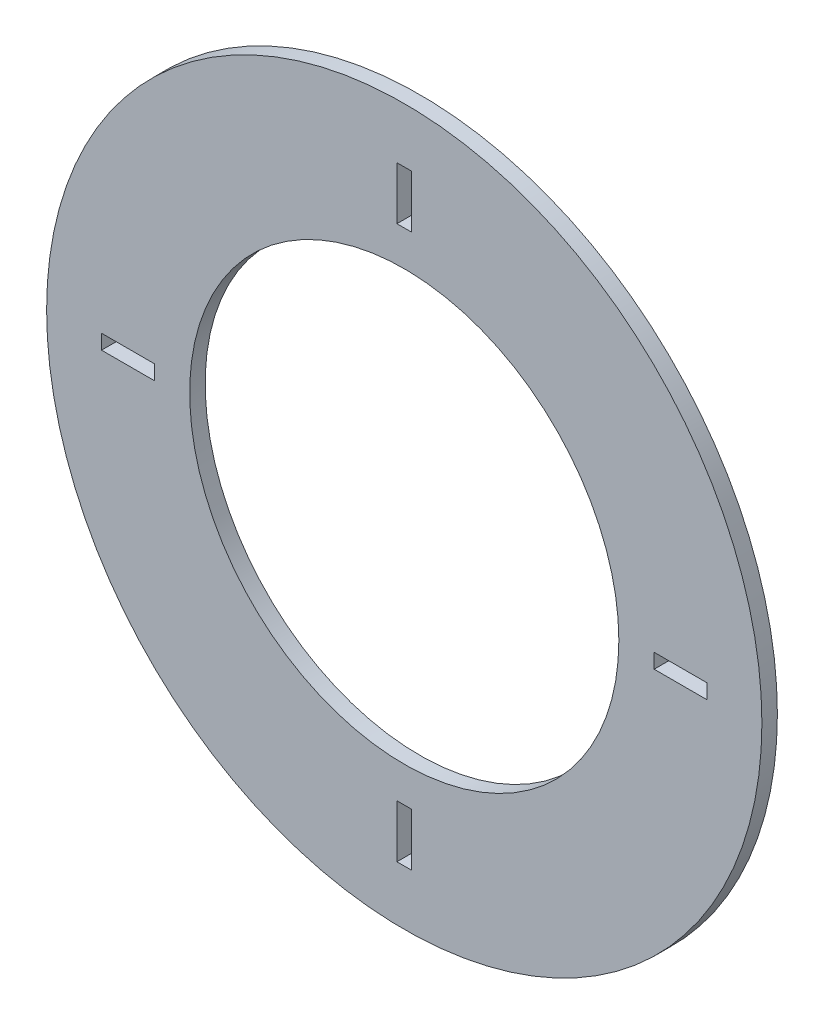
ISO-10303-21;
HEADER;
FILE_DESCRIPTION(('STEP AP214'),'2;1');
FILE_NAME('part.step','',(''),(''),'','','');
FILE_SCHEMA(('AUTOMOTIVE_DESIGN { 1 0 10303 214 1 1 1 1 }'));
ENDSEC;
DATA;
#1=APPLICATION_CONTEXT('core data for automotive mechanical design processes');
#2=APPLICATION_PROTOCOL_DEFINITION('international standard','automotive_design',2000,#1);
#3=PRODUCT_CONTEXT('',#1,'mechanical');
#4=PRODUCT('Part','Part','',(#3));
#5=PRODUCT_RELATED_PRODUCT_CATEGORY('part','',(#4));
#6=PRODUCT_DEFINITION_FORMATION('','',#4);
#7=PRODUCT_DEFINITION_CONTEXT('part definition',#1,'design');
#8=PRODUCT_DEFINITION('design','',#6,#7);
#9=PRODUCT_DEFINITION_SHAPE('','',#8);
#10=(LENGTH_UNIT() NAMED_UNIT(*) SI_UNIT(.MILLI.,.METRE.));
#11=(NAMED_UNIT(*) PLANE_ANGLE_UNIT() SI_UNIT($,.RADIAN.));
#12=(NAMED_UNIT(*) SI_UNIT($,.STERADIAN.) SOLID_ANGLE_UNIT());
#13=UNCERTAINTY_MEASURE_WITH_UNIT(LENGTH_MEASURE(1.E-05),#10,'distance_accuracy_value','');
#14=(GEOMETRIC_REPRESENTATION_CONTEXT(3) GLOBAL_UNCERTAINTY_ASSIGNED_CONTEXT((#13)) GLOBAL_UNIT_ASSIGNED_CONTEXT((#10,
#11,#12)) REPRESENTATION_CONTEXT('',''));
#15=CARTESIAN_POINT('',(0.,0.,0.));
#16=DIRECTION('',(0.,0.,1.));
#17=DIRECTION('',(1.,0.,0.));
#18=AXIS2_PLACEMENT_3D('',#15,#16,#17);
#19=CARTESIAN_POINT('',(0.,0.,2.750000088));
#20=DIRECTION('',(0.,0.,1.));
#21=DIRECTION('',(1.,0.,0.));
#22=AXIS2_PLACEMENT_3D('',#19,#20,#21);
#23=PLANE('',#22);
#24=DIRECTION('',(0.,1.,0.));
#25=VECTOR('',#24,1.);
#26=CARTESIAN_POINT('',(1.302500062,53.7452039097512,2.750000088));
#27=LINE('',#26,#25);
#28=CARTESIAN_POINT('',(1.302500062,44.3652038737512,2.750000088));
#29=VERTEX_POINT('',#28);
#30=CARTESIAN_POINT('',(1.302500062,53.7452039097512,2.750000088));
#31=VERTEX_POINT('',#30);
#32=EDGE_CURVE('E61',#29,#31,#27,.T.);
#33=ORIENTED_EDGE('',*,*,#32,.F.);
#34=DIRECTION('',(1.,0.,0.));
#35=VECTOR('',#34,1.);
#36=CARTESIAN_POINT('',(-1.302500062,44.3652038737512,2.750000088));
#37=LINE('',#36,#35);
#38=CARTESIAN_POINT('',(-1.302500062,44.3652038737512,2.750000088));
#39=VERTEX_POINT('',#38);
#40=EDGE_CURVE('E183',#39,#29,#37,.T.);
#41=ORIENTED_EDGE('',*,*,#40,.F.);
#42=DIRECTION('',(0.,-1.,0.));
#43=VECTOR('',#42,1.);
#44=CARTESIAN_POINT('',(-1.302500062,53.7452039097512,2.750000088));
#45=LINE('',#44,#43);
#46=CARTESIAN_POINT('',(-1.302500062,53.7452039097512,2.750000088));
#47=VERTEX_POINT('',#46);
#48=EDGE_CURVE('E187',#47,#39,#45,.T.);
#49=ORIENTED_EDGE('',*,*,#48,.F.);
#50=DIRECTION('',(-1.,0.,0.));
#51=VECTOR('',#50,1.);
#52=CARTESIAN_POINT('',(-1.302500062,53.7452039097512,2.750000088));
#53=LINE('',#52,#51);
#54=EDGE_CURVE('E196',#31,#47,#53,.T.);
#55=ORIENTED_EDGE('',*,*,#54,.F.);
#56=EDGE_LOOP('',(#33,#41,#49,#55));
#57=FACE_BOUND('',#56,.T.);
#58=DIRECTION('',(0.,-1.,0.));
#59=VECTOR('',#58,1.);
#60=CARTESIAN_POINT('',(44.3652038737512,1.302500062,2.750000088));
#61=LINE('',#60,#59);
#62=CARTESIAN_POINT('',(44.3652038737512,1.302500062,2.750000088));
#63=VERTEX_POINT('',#62);
#64=CARTESIAN_POINT('',(44.3652038737512,-1.302500062,2.750000088));
#65=VERTEX_POINT('',#64);
#66=EDGE_CURVE('E69',#63,#65,#61,.T.);
#67=ORIENTED_EDGE('',*,*,#66,.F.);
#68=DIRECTION('',(-1.,0.,0.));
#69=VECTOR('',#68,1.);
#70=CARTESIAN_POINT('',(53.7452039097512,1.302500062,2.750000088));
#71=LINE('',#70,#69);
#72=CARTESIAN_POINT('',(53.7452039097512,1.302500062,2.750000088));
#73=VERTEX_POINT('',#72);
#74=EDGE_CURVE('E225',#73,#63,#71,.T.);
#75=ORIENTED_EDGE('',*,*,#74,.F.);
#76=DIRECTION('',(0.,1.,0.));
#77=VECTOR('',#76,1.);
#78=CARTESIAN_POINT('',(53.7452039097512,1.302500062,2.750000088));
#79=LINE('',#78,#77);
#80=CARTESIAN_POINT('',(53.7452039097512,-1.302500062,2.750000088));
#81=VERTEX_POINT('',#80);
#82=EDGE_CURVE('E229',#81,#73,#79,.T.);
#83=ORIENTED_EDGE('',*,*,#82,.F.);
#84=DIRECTION('',(1.,0.,0.));
#85=VECTOR('',#84,1.);
#86=CARTESIAN_POINT('',(53.7452039097512,-1.302500062,2.750000088));
#87=LINE('',#86,#85);
#88=EDGE_CURVE('E234',#65,#81,#87,.T.);
#89=ORIENTED_EDGE('',*,*,#88,.F.);
#90=EDGE_LOOP('',(#67,#75,#83,#89));
#91=FACE_BOUND('',#90,.T.);
#92=DIRECTION('',(-1.,0.,0.));
#93=VECTOR('',#92,1.);
#94=CARTESIAN_POINT('',(1.302500062,-44.3652038737512,2.750000088));
#95=LINE('',#94,#93);
#96=CARTESIAN_POINT('',(1.302500062,-44.3652038737512,2.750000088));
#97=VERTEX_POINT('',#96);
#98=CARTESIAN_POINT('',(-1.302500062,-44.3652038737512,2.750000088));
#99=VERTEX_POINT('',#98);
#100=EDGE_CURVE('E224',#97,#99,#95,.T.);
#101=ORIENTED_EDGE('',*,*,#100,.F.);
#102=DIRECTION('',(0.,1.,0.));
#103=VECTOR('',#102,1.);
#104=CARTESIAN_POINT('',(1.30250006200001,-53.7452039097512,2.750000088));
#105=LINE('',#104,#103);
#106=CARTESIAN_POINT('',(1.30250006200001,-53.7452039097512,2.750000088));
#107=VERTEX_POINT('',#106);
#108=EDGE_CURVE('E269',#107,#97,#105,.T.);
#109=ORIENTED_EDGE('',*,*,#108,.F.);
#110=DIRECTION('',(1.,0.,0.));
#111=VECTOR('',#110,1.);
#112=CARTESIAN_POINT('',(1.30250006200001,-53.7452039097512,2.750000088));
#113=LINE('',#112,#111);
#114=CARTESIAN_POINT('',(-1.30250006199999,-53.7452039097512,2.750000088));
#115=VERTEX_POINT('',#114);
#116=EDGE_CURVE('E273',#115,#107,#113,.T.);
#117=ORIENTED_EDGE('',*,*,#116,.F.);
#118=DIRECTION('',(0.,-1.,0.));
#119=VECTOR('',#118,1.);
#120=CARTESIAN_POINT('',(-1.30250006199999,-53.7452039097512,2.750000088));
#121=LINE('',#120,#119);
#122=EDGE_CURVE('E278',#99,#115,#121,.T.);
#123=ORIENTED_EDGE('',*,*,#122,.F.);
#124=EDGE_LOOP('',(#101,#109,#117,#123));
#125=FACE_BOUND('',#124,.T.);
#126=DIRECTION('',(0.,1.,0.));
#127=VECTOR('',#126,1.);
#128=CARTESIAN_POINT('',(-44.3652038737512,-1.30250006200001,2.750000088));
#129=LINE('',#128,#127);
#130=CARTESIAN_POINT('',(-44.3652038737512,-1.30250006200001,2.750000088));
#131=VERTEX_POINT('',#130);
#132=CARTESIAN_POINT('',(-44.3652038737512,1.30250006199999,2.750000088));
#133=VERTEX_POINT('',#132);
#134=EDGE_CURVE('E268',#131,#133,#129,.T.);
#135=ORIENTED_EDGE('',*,*,#134,.F.);
#136=DIRECTION('',(1.,0.,0.));
#137=VECTOR('',#136,1.);
#138=CARTESIAN_POINT('',(-53.7452039097512,-1.30250006200001,2.750000088));
#139=LINE('',#138,#137);
#140=CARTESIAN_POINT('',(-53.7452039097512,-1.30250006200001,2.750000088));
#141=VERTEX_POINT('',#140);
#142=EDGE_CURVE('E312',#141,#131,#139,.T.);
#143=ORIENTED_EDGE('',*,*,#142,.F.);
#144=DIRECTION('',(0.,-1.,0.));
#145=VECTOR('',#144,1.);
#146=CARTESIAN_POINT('',(-53.7452039097512,-1.30250006200001,2.750000088));
#147=LINE('',#146,#145);
#148=CARTESIAN_POINT('',(-53.7452039097512,1.30250006199999,2.750000088));
#149=VERTEX_POINT('',#148);
#150=EDGE_CURVE('E316',#149,#141,#147,.T.);
#151=ORIENTED_EDGE('',*,*,#150,.F.);
#152=DIRECTION('',(-1.,0.,0.));
#153=VECTOR('',#152,1.);
#154=CARTESIAN_POINT('',(-53.7452039097512,1.30250006199999,2.750000088));
#155=LINE('',#154,#153);
#156=EDGE_CURVE('E321',#133,#149,#155,.T.);
#157=ORIENTED_EDGE('',*,*,#156,.F.);
#158=EDGE_LOOP('',(#135,#143,#151,#157));
#159=FACE_BOUND('',#158,.T.);
#160=CARTESIAN_POINT('',(0.,0.,2.750000088));
#161=DIRECTION('',(0.,0.,1.));
#162=DIRECTION('',(1.,0.,0.));
#163=AXIS2_PLACEMENT_3D('',#160,#161,#162);
#164=CIRCLE('',#163,63.5);
#165=CARTESIAN_POINT('',(63.5,0.,2.750000088));
#166=VERTEX_POINT('',#165);
#167=EDGE_CURVE('E11',#166,#166,#164,.T.);
#168=ORIENTED_EDGE('',*,*,#167,.T.);
#169=EDGE_LOOP('',(#168));
#170=FACE_BOUND('',#169,.T.);
#171=CARTESIAN_POINT('',(0.,0.,2.750000088));
#172=DIRECTION('',(0.,0.,1.));
#173=DIRECTION('',(1.,0.,0.));
#174=AXIS2_PLACEMENT_3D('',#171,#172,#173);
#175=CIRCLE('',#174,38.1);
#176=CARTESIAN_POINT('',(38.1,0.,2.750000088));
#177=VERTEX_POINT('',#176);
#178=EDGE_CURVE('E341',#177,#177,#175,.T.);
#179=ORIENTED_EDGE('',*,*,#178,.F.);
#180=EDGE_LOOP('',(#179));
#181=FACE_BOUND('',#180,.T.);
#182=ADVANCED_FACE('F45',(#57,#91,#125,#159,#170,#181),#23,.T.);
#183=CARTESIAN_POINT('',(0.,0.,0.));
#184=DIRECTION('',(0.,0.,1.));
#185=DIRECTION('',(1.,0.,0.));
#186=AXIS2_PLACEMENT_3D('',#183,#184,#185);
#187=PLANE('',#186);
#188=DIRECTION('',(1.,0.,0.));
#189=VECTOR('',#188,1.);
#190=CARTESIAN_POINT('',(-1.302500062,44.3652038737512,0.));
#191=LINE('',#190,#189);
#192=CARTESIAN_POINT('',(-1.302500062,44.3652038737512,0.));
#193=VERTEX_POINT('',#192);
#194=CARTESIAN_POINT('',(1.302500062,44.3652038737512,0.));
#195=VERTEX_POINT('',#194);
#196=EDGE_CURVE('E168',#193,#195,#191,.T.);
#197=ORIENTED_EDGE('',*,*,#196,.T.);
#198=DIRECTION('',(0.,1.,0.));
#199=VECTOR('',#198,1.);
#200=CARTESIAN_POINT('',(1.302500062,53.7452039097512,0.));
#201=LINE('',#200,#199);
#202=CARTESIAN_POINT('',(1.302500062,53.7452039097512,0.));
#203=VERTEX_POINT('',#202);
#204=EDGE_CURVE('E161',#195,#203,#201,.T.);
#205=ORIENTED_EDGE('',*,*,#204,.T.);
#206=DIRECTION('',(-1.,0.,0.));
#207=VECTOR('',#206,1.);
#208=CARTESIAN_POINT('',(-1.302500062,53.7452039097512,0.));
#209=LINE('',#208,#207);
#210=CARTESIAN_POINT('',(-1.302500062,53.7452039097512,0.));
#211=VERTEX_POINT('',#210);
#212=EDGE_CURVE('E172',#203,#211,#209,.T.);
#213=ORIENTED_EDGE('',*,*,#212,.T.);
#214=DIRECTION('',(0.,-1.,0.));
#215=VECTOR('',#214,1.);
#216=CARTESIAN_POINT('',(-1.302500062,53.7452039097512,0.));
#217=LINE('',#216,#215);
#218=EDGE_CURVE('E177',#211,#193,#217,.T.);
#219=ORIENTED_EDGE('',*,*,#218,.T.);
#220=EDGE_LOOP('',(#197,#205,#213,#219));
#221=FACE_BOUND('',#220,.T.);
#222=DIRECTION('',(-1.,0.,0.));
#223=VECTOR('',#222,1.);
#224=CARTESIAN_POINT('',(53.7452039097512,1.302500062,0.));
#225=LINE('',#224,#223);
#226=CARTESIAN_POINT('',(53.7452039097512,1.302500062,0.));
#227=VERTEX_POINT('',#226);
#228=CARTESIAN_POINT('',(44.3652038737512,1.302500062,0.));
#229=VERTEX_POINT('',#228);
#230=EDGE_CURVE('E214',#227,#229,#225,.T.);
#231=ORIENTED_EDGE('',*,*,#230,.T.);
#232=DIRECTION('',(0.,-1.,0.));
#233=VECTOR('',#232,1.);
#234=CARTESIAN_POINT('',(44.3652038737512,1.302500062,0.));
#235=LINE('',#234,#233);
#236=CARTESIAN_POINT('',(44.3652038737512,-1.302500062,0.));
#237=VERTEX_POINT('',#236);
#238=EDGE_CURVE('E230',#229,#237,#235,.T.);
#239=ORIENTED_EDGE('',*,*,#238,.T.);
#240=DIRECTION('',(1.,0.,0.));
#241=VECTOR('',#240,1.);
#242=CARTESIAN_POINT('',(53.7452039097512,-1.302500062,0.));
#243=LINE('',#242,#241);
#244=CARTESIAN_POINT('',(53.7452039097512,-1.302500062,0.));
#245=VERTEX_POINT('',#244);
#246=EDGE_CURVE('E247',#237,#245,#243,.T.);
#247=ORIENTED_EDGE('',*,*,#246,.T.);
#248=DIRECTION('',(0.,1.,0.));
#249=VECTOR('',#248,1.);
#250=CARTESIAN_POINT('',(53.7452039097512,1.302500062,0.));
#251=LINE('',#250,#249);
#252=EDGE_CURVE('E243',#245,#227,#251,.T.);
#253=ORIENTED_EDGE('',*,*,#252,.T.);
#254=EDGE_LOOP('',(#231,#239,#247,#253));
#255=FACE_BOUND('',#254,.T.);
#256=DIRECTION('',(0.,1.,0.));
#257=VECTOR('',#256,1.);
#258=CARTESIAN_POINT('',(1.30250006200001,-53.7452039097512,0.));
#259=LINE('',#258,#257);
#260=CARTESIAN_POINT('',(1.30250006200001,-53.7452039097512,0.));
#261=VERTEX_POINT('',#260);
#262=CARTESIAN_POINT('',(1.302500062,-44.3652038737512,0.));
#263=VERTEX_POINT('',#262);
#264=EDGE_CURVE('E258',#261,#263,#259,.T.);
#265=ORIENTED_EDGE('',*,*,#264,.T.);
#266=DIRECTION('',(-1.,0.,0.));
#267=VECTOR('',#266,1.);
#268=CARTESIAN_POINT('',(1.302500062,-44.3652038737512,0.));
#269=LINE('',#268,#267);
#270=CARTESIAN_POINT('',(-1.302500062,-44.3652038737512,0.));
#271=VERTEX_POINT('',#270);
#272=EDGE_CURVE('E274',#263,#271,#269,.T.);
#273=ORIENTED_EDGE('',*,*,#272,.T.);
#274=DIRECTION('',(0.,-1.,0.));
#275=VECTOR('',#274,1.);
#276=CARTESIAN_POINT('',(-1.30250006199999,-53.7452039097512,0.));
#277=LINE('',#276,#275);
#278=CARTESIAN_POINT('',(-1.30250006199999,-53.7452039097512,0.));
#279=VERTEX_POINT('',#278);
#280=EDGE_CURVE('E291',#271,#279,#277,.T.);
#281=ORIENTED_EDGE('',*,*,#280,.T.);
#282=DIRECTION('',(1.,0.,0.));
#283=VECTOR('',#282,1.);
#284=CARTESIAN_POINT('',(1.30250006200001,-53.7452039097512,0.));
#285=LINE('',#284,#283);
#286=EDGE_CURVE('E287',#279,#261,#285,.T.);
#287=ORIENTED_EDGE('',*,*,#286,.T.);
#288=EDGE_LOOP('',(#265,#273,#281,#287));
#289=FACE_BOUND('',#288,.T.);
#290=DIRECTION('',(1.,0.,0.));
#291=VECTOR('',#290,1.);
#292=CARTESIAN_POINT('',(-53.7452039097512,-1.30250006200001,0.));
#293=LINE('',#292,#291);
#294=CARTESIAN_POINT('',(-53.7452039097512,-1.30250006200001,0.));
#295=VERTEX_POINT('',#294);
#296=CARTESIAN_POINT('',(-44.3652038737512,-1.30250006200001,0.));
#297=VERTEX_POINT('',#296);
#298=EDGE_CURVE('E302',#295,#297,#293,.T.);
#299=ORIENTED_EDGE('',*,*,#298,.T.);
#300=DIRECTION('',(0.,1.,0.));
#301=VECTOR('',#300,1.);
#302=CARTESIAN_POINT('',(-44.3652038737512,-1.30250006200001,0.));
#303=LINE('',#302,#301);
#304=CARTESIAN_POINT('',(-44.3652038737512,1.30250006199999,0.));
#305=VERTEX_POINT('',#304);
#306=EDGE_CURVE('E317',#297,#305,#303,.T.);
#307=ORIENTED_EDGE('',*,*,#306,.T.);
#308=DIRECTION('',(-1.,0.,0.));
#309=VECTOR('',#308,1.);
#310=CARTESIAN_POINT('',(-53.7452039097512,1.30250006199999,0.));
#311=LINE('',#310,#309);
#312=CARTESIAN_POINT('',(-53.7452039097512,1.30250006199999,0.));
#313=VERTEX_POINT('',#312);
#314=EDGE_CURVE('E334',#305,#313,#311,.T.);
#315=ORIENTED_EDGE('',*,*,#314,.T.);
#316=DIRECTION('',(0.,-1.,0.));
#317=VECTOR('',#316,1.);
#318=CARTESIAN_POINT('',(-53.7452039097512,-1.30250006200001,0.));
#319=LINE('',#318,#317);
#320=EDGE_CURVE('E330',#313,#295,#319,.T.);
#321=ORIENTED_EDGE('',*,*,#320,.T.);
#322=EDGE_LOOP('',(#299,#307,#315,#321));
#323=FACE_BOUND('',#322,.T.);
#324=CARTESIAN_POINT('',(0.,0.,0.));
#325=DIRECTION('',(0.,0.,1.));
#326=DIRECTION('',(1.,0.,0.));
#327=AXIS2_PLACEMENT_3D('',#324,#325,#326);
#328=CIRCLE('',#327,63.5);
#329=CARTESIAN_POINT('',(63.5,0.,0.));
#330=VERTEX_POINT('',#329);
#331=EDGE_CURVE('E49',#330,#330,#328,.T.);
#332=ORIENTED_EDGE('',*,*,#331,.F.);
#333=EDGE_LOOP('',(#332));
#334=FACE_BOUND('',#333,.T.);
#335=CARTESIAN_POINT('',(0.,0.,0.));
#336=DIRECTION('',(0.,0.,1.));
#337=DIRECTION('',(1.,0.,0.));
#338=AXIS2_PLACEMENT_3D('',#335,#336,#337);
#339=CIRCLE('',#338,38.1);
#340=CARTESIAN_POINT('',(38.1,0.,0.));
#341=VERTEX_POINT('',#340);
#342=EDGE_CURVE('E205',#341,#341,#339,.T.);
#343=ORIENTED_EDGE('',*,*,#342,.T.);
#344=EDGE_LOOP('',(#343));
#345=FACE_BOUND('',#344,.T.);
#346=ADVANCED_FACE('F179',(#221,#255,#289,#323,#334,#345),#187,.F.);
#347=CARTESIAN_POINT('',(0.,0.,2.750000088));
#348=DIRECTION('',(0.,0.,-1.));
#349=DIRECTION('',(-1.,0.,0.));
#350=AXIS2_PLACEMENT_3D('',#347,#348,#349);
#351=CYLINDRICAL_SURFACE('',#350,63.5);
#352=ORIENTED_EDGE('',*,*,#167,.F.);
#353=EDGE_LOOP('',(#352));
#354=FACE_BOUND('',#353,.T.);
#355=ORIENTED_EDGE('',*,*,#331,.T.);
#356=EDGE_LOOP('',(#355));
#357=FACE_BOUND('',#356,.T.);
#358=ADVANCED_FACE('F47',(#354,#357),#351,.T.);
#359=CARTESIAN_POINT('',(0.,0.,2.750000088));
#360=DIRECTION('',(0.,0.,-1.));
#361=DIRECTION('',(-1.,0.,0.));
#362=AXIS2_PLACEMENT_3D('',#359,#360,#361);
#363=CYLINDRICAL_SURFACE('',#362,38.1);
#364=ORIENTED_EDGE('',*,*,#178,.T.);
#365=EDGE_LOOP('',(#364));
#366=FACE_BOUND('',#365,.T.);
#367=ORIENTED_EDGE('',*,*,#342,.F.);
#368=EDGE_LOOP('',(#367));
#369=FACE_BOUND('',#368,.T.);
#370=ADVANCED_FACE('F350',(#366,#369),#363,.F.);
#371=CARTESIAN_POINT('',(-44.3652038737512,-1.30250006200001,0.));
#372=DIRECTION('',(1.,0.,0.));
#373=DIRECTION('',(0.,0.,-1.));
#374=AXIS2_PLACEMENT_3D('',#371,#372,#373);
#375=PLANE('',#374);
#376=ORIENTED_EDGE('',*,*,#134,.T.);
#377=DIRECTION('',(0.,0.,1.));
#378=VECTOR('',#377,1.);
#379=CARTESIAN_POINT('',(-44.3652038737512,1.30250006199999,0.));
#380=LINE('',#379,#378);
#381=EDGE_CURVE('E298',#305,#133,#380,.T.);
#382=ORIENTED_EDGE('',*,*,#381,.F.);
#383=ORIENTED_EDGE('',*,*,#306,.F.);
#384=DIRECTION('',(0.,0.,1.));
#385=VECTOR('',#384,1.);
#386=CARTESIAN_POINT('',(-44.3652038737512,-1.30250006200001,0.));
#387=LINE('',#386,#385);
#388=EDGE_CURVE('E309',#297,#131,#387,.T.);
#389=ORIENTED_EDGE('',*,*,#388,.T.);
#390=EDGE_LOOP('',(#376,#382,#383,#389));
#391=FACE_BOUND('',#390,.T.);
#392=ADVANCED_FACE('F352',(#391),#375,.F.);
#393=CARTESIAN_POINT('',(-53.7452039097512,-1.30250006200001,0.));
#394=DIRECTION('',(0.,-1.,0.));
#395=DIRECTION('',(1.,0.,0.));
#396=AXIS2_PLACEMENT_3D('',#393,#394,#395);
#397=PLANE('',#396);
#398=ORIENTED_EDGE('',*,*,#142,.T.);
#399=ORIENTED_EDGE('',*,*,#388,.F.);
#400=ORIENTED_EDGE('',*,*,#298,.F.);
#401=DIRECTION('',(0.,0.,1.));
#402=VECTOR('',#401,1.);
#403=CARTESIAN_POINT('',(-53.7452039097512,-1.30250006200001,0.));
#404=LINE('',#403,#402);
#405=EDGE_CURVE('E306',#295,#141,#404,.T.);
#406=ORIENTED_EDGE('',*,*,#405,.T.);
#407=EDGE_LOOP('',(#398,#399,#400,#406));
#408=FACE_BOUND('',#407,.T.);
#409=ADVANCED_FACE('F360',(#408),#397,.F.);
#410=CARTESIAN_POINT('',(-53.7452039097512,-1.30250006200001,0.));
#411=DIRECTION('',(-1.,0.,0.));
#412=DIRECTION('',(0.,0.,1.));
#413=AXIS2_PLACEMENT_3D('',#410,#411,#412);
#414=PLANE('',#413);
#415=ORIENTED_EDGE('',*,*,#150,.T.);
#416=ORIENTED_EDGE('',*,*,#405,.F.);
#417=ORIENTED_EDGE('',*,*,#320,.F.);
#418=DIRECTION('',(0.,0.,1.));
#419=VECTOR('',#418,1.);
#420=CARTESIAN_POINT('',(-53.7452039097512,1.30250006199999,0.));
#421=LINE('',#420,#419);
#422=EDGE_CURVE('E303',#313,#149,#421,.T.);
#423=ORIENTED_EDGE('',*,*,#422,.T.);
#424=EDGE_LOOP('',(#415,#416,#417,#423));
#425=FACE_BOUND('',#424,.T.);
#426=ADVANCED_FACE('F401',(#425),#414,.F.);
#427=CARTESIAN_POINT('',(-53.7452039097512,1.30250006199999,0.));
#428=DIRECTION('',(0.,1.,0.));
#429=DIRECTION('',(-1.,0.,0.));
#430=AXIS2_PLACEMENT_3D('',#427,#428,#429);
#431=PLANE('',#430);
#432=ORIENTED_EDGE('',*,*,#156,.T.);
#433=ORIENTED_EDGE('',*,*,#422,.F.);
#434=ORIENTED_EDGE('',*,*,#314,.F.);
#435=ORIENTED_EDGE('',*,*,#381,.T.);
#436=EDGE_LOOP('',(#432,#433,#434,#435));
#437=FACE_BOUND('',#436,.T.);
#438=ADVANCED_FACE('F395',(#437),#431,.F.);
#439=CARTESIAN_POINT('',(1.302500062,-44.3652038737512,0.));
#440=DIRECTION('',(0.,1.,0.));
#441=DIRECTION('',(0.,0.,1.));
#442=AXIS2_PLACEMENT_3D('',#439,#440,#441);
#443=PLANE('',#442);
#444=ORIENTED_EDGE('',*,*,#100,.T.);
#445=DIRECTION('',(0.,0.,1.));
#446=VECTOR('',#445,1.);
#447=CARTESIAN_POINT('',(-1.302500062,-44.3652038737512,0.));
#448=LINE('',#447,#446);
#449=EDGE_CURVE('E254',#271,#99,#448,.T.);
#450=ORIENTED_EDGE('',*,*,#449,.F.);
#451=ORIENTED_EDGE('',*,*,#272,.F.);
#452=DIRECTION('',(0.,0.,1.));
#453=VECTOR('',#452,1.);
#454=CARTESIAN_POINT('',(1.302500062,-44.3652038737512,0.));
#455=LINE('',#454,#453);
#456=EDGE_CURVE('E265',#263,#97,#455,.T.);
#457=ORIENTED_EDGE('',*,*,#456,.T.);
#458=EDGE_LOOP('',(#444,#450,#451,#457));
#459=FACE_BOUND('',#458,.T.);
#460=ADVANCED_FACE('F408',(#459),#443,.F.);
#461=CARTESIAN_POINT('',(1.30250006200001,-53.7452039097512,0.));
#462=DIRECTION('',(1.,0.,0.));
#463=DIRECTION('',(0.,1.,0.));
#464=AXIS2_PLACEMENT_3D('',#461,#462,#463);
#465=PLANE('',#464);
#466=ORIENTED_EDGE('',*,*,#108,.T.);
#467=ORIENTED_EDGE('',*,*,#456,.F.);
#468=ORIENTED_EDGE('',*,*,#264,.F.);
#469=DIRECTION('',(0.,0.,1.));
#470=VECTOR('',#469,1.);
#471=CARTESIAN_POINT('',(1.30250006200001,-53.7452039097512,0.));
#472=LINE('',#471,#470);
#473=EDGE_CURVE('E262',#261,#107,#472,.T.);
#474=ORIENTED_EDGE('',*,*,#473,.T.);
#475=EDGE_LOOP('',(#466,#467,#468,#474));
#476=FACE_BOUND('',#475,.T.);
#477=ADVANCED_FACE('F411',(#476),#465,.F.);
#478=CARTESIAN_POINT('',(1.30250006200001,-53.7452039097512,0.));
#479=DIRECTION('',(0.,-1.,0.));
#480=DIRECTION('',(0.,0.,-1.));
#481=AXIS2_PLACEMENT_3D('',#478,#479,#480);
#482=PLANE('',#481);
#483=ORIENTED_EDGE('',*,*,#116,.T.);
#484=ORIENTED_EDGE('',*,*,#473,.F.);
#485=ORIENTED_EDGE('',*,*,#286,.F.);
#486=DIRECTION('',(0.,0.,1.));
#487=VECTOR('',#486,1.);
#488=CARTESIAN_POINT('',(-1.30250006199999,-53.7452039097512,0.));
#489=LINE('',#488,#487);
#490=EDGE_CURVE('E259',#279,#115,#489,.T.);
#491=ORIENTED_EDGE('',*,*,#490,.T.);
#492=EDGE_LOOP('',(#483,#484,#485,#491));
#493=FACE_BOUND('',#492,.T.);
#494=ADVANCED_FACE('F414',(#493),#482,.F.);
#495=CARTESIAN_POINT('',(-1.30250006199999,-53.7452039097512,0.));
#496=DIRECTION('',(-1.,0.,0.));
#497=DIRECTION('',(0.,-1.,0.));
#498=AXIS2_PLACEMENT_3D('',#495,#496,#497);
#499=PLANE('',#498);
#500=ORIENTED_EDGE('',*,*,#122,.T.);
#501=ORIENTED_EDGE('',*,*,#490,.F.);
#502=ORIENTED_EDGE('',*,*,#280,.F.);
#503=ORIENTED_EDGE('',*,*,#449,.T.);
#504=EDGE_LOOP('',(#500,#501,#502,#503));
#505=FACE_BOUND('',#504,.T.);
#506=ADVANCED_FACE('F418',(#505),#499,.F.);
#507=CARTESIAN_POINT('',(44.3652038737512,1.302500062,0.));
#508=DIRECTION('',(-1.,0.,0.));
#509=DIRECTION('',(0.,0.,1.));
#510=AXIS2_PLACEMENT_3D('',#507,#508,#509);
#511=PLANE('',#510);
#512=ORIENTED_EDGE('',*,*,#66,.T.);
#513=DIRECTION('',(0.,0.,1.));
#514=VECTOR('',#513,1.);
#515=CARTESIAN_POINT('',(44.3652038737512,-1.302500062,0.));
#516=LINE('',#515,#514);
#517=EDGE_CURVE('E211',#237,#65,#516,.T.);
#518=ORIENTED_EDGE('',*,*,#517,.F.);
#519=ORIENTED_EDGE('',*,*,#238,.F.);
#520=DIRECTION('',(0.,0.,1.));
#521=VECTOR('',#520,1.);
#522=CARTESIAN_POINT('',(44.3652038737512,1.302500062,0.));
#523=LINE('',#522,#521);
#524=EDGE_CURVE('E221',#229,#63,#523,.T.);
#525=ORIENTED_EDGE('',*,*,#524,.T.);
#526=EDGE_LOOP('',(#512,#518,#519,#525));
#527=FACE_BOUND('',#526,.T.);
#528=ADVANCED_FACE('F422',(#527),#511,.F.);
#529=CARTESIAN_POINT('',(53.7452039097512,1.302500062,0.));
#530=DIRECTION('',(0.,1.,0.));
#531=DIRECTION('',(-1.,0.,0.));
#532=AXIS2_PLACEMENT_3D('',#529,#530,#531);
#533=PLANE('',#532);
#534=ORIENTED_EDGE('',*,*,#74,.T.);
#535=ORIENTED_EDGE('',*,*,#524,.F.);
#536=ORIENTED_EDGE('',*,*,#230,.F.);
#537=DIRECTION('',(0.,0.,1.));
#538=VECTOR('',#537,1.);
#539=CARTESIAN_POINT('',(53.7452039097512,1.302500062,0.));
#540=LINE('',#539,#538);
#541=EDGE_CURVE('E218',#227,#73,#540,.T.);
#542=ORIENTED_EDGE('',*,*,#541,.T.);
#543=EDGE_LOOP('',(#534,#535,#536,#542));
#544=FACE_BOUND('',#543,.T.);
#545=ADVANCED_FACE('F427',(#544),#533,.F.);
#546=CARTESIAN_POINT('',(53.7452039097512,1.302500062,0.));
#547=DIRECTION('',(1.,0.,0.));
#548=DIRECTION('',(0.,0.,-1.));
#549=AXIS2_PLACEMENT_3D('',#546,#547,#548);
#550=PLANE('',#549);
#551=ORIENTED_EDGE('',*,*,#82,.T.);
#552=ORIENTED_EDGE('',*,*,#541,.F.);
#553=ORIENTED_EDGE('',*,*,#252,.F.);
#554=DIRECTION('',(0.,0.,1.));
#555=VECTOR('',#554,1.);
#556=CARTESIAN_POINT('',(53.7452039097512,-1.302500062,0.));
#557=LINE('',#556,#555);
#558=EDGE_CURVE('E215',#245,#81,#557,.T.);
#559=ORIENTED_EDGE('',*,*,#558,.T.);
#560=EDGE_LOOP('',(#551,#552,#553,#559));
#561=FACE_BOUND('',#560,.T.);
#562=ADVANCED_FACE('F430',(#561),#550,.F.);
#563=CARTESIAN_POINT('',(53.7452039097512,-1.302500062,0.));
#564=DIRECTION('',(0.,-1.,0.));
#565=DIRECTION('',(1.,0.,0.));
#566=AXIS2_PLACEMENT_3D('',#563,#564,#565);
#567=PLANE('',#566);
#568=ORIENTED_EDGE('',*,*,#88,.T.);
#569=ORIENTED_EDGE('',*,*,#558,.F.);
#570=ORIENTED_EDGE('',*,*,#246,.F.);
#571=ORIENTED_EDGE('',*,*,#517,.T.);
#572=EDGE_LOOP('',(#568,#569,#570,#571));
#573=FACE_BOUND('',#572,.T.);
#574=ADVANCED_FACE('F434',(#573),#567,.F.);
#575=CARTESIAN_POINT('',(1.302500062,53.7452039097512,0.));
#576=DIRECTION('',(1.,0.,0.));
#577=DIRECTION('',(0.,1.,0.));
#578=AXIS2_PLACEMENT_3D('',#575,#576,#577);
#579=PLANE('',#578);
#580=ORIENTED_EDGE('',*,*,#32,.T.);
#581=DIRECTION('',(0.,0.,1.));
#582=VECTOR('',#581,1.);
#583=CARTESIAN_POINT('',(1.302500062,53.7452039097512,0.));
#584=LINE('',#583,#582);
#585=EDGE_CURVE('E157',#203,#31,#584,.T.);
#586=ORIENTED_EDGE('',*,*,#585,.F.);
#587=ORIENTED_EDGE('',*,*,#204,.F.);
#588=DIRECTION('',(0.,0.,1.));
#589=VECTOR('',#588,1.);
#590=CARTESIAN_POINT('',(1.302500062,44.3652038737512,0.));
#591=LINE('',#590,#589);
#592=EDGE_CURVE('E202',#195,#29,#591,.T.);
#593=ORIENTED_EDGE('',*,*,#592,.T.);
#594=EDGE_LOOP('',(#580,#586,#587,#593));
#595=FACE_BOUND('',#594,.T.);
#596=ADVANCED_FACE('F159',(#595),#579,.F.);
#597=CARTESIAN_POINT('',(-1.302500062,44.3652038737512,0.));
#598=DIRECTION('',(0.,-1.,0.));
#599=DIRECTION('',(0.,0.,-1.));
#600=AXIS2_PLACEMENT_3D('',#597,#598,#599);
#601=PLANE('',#600);
#602=ORIENTED_EDGE('',*,*,#40,.T.);
#603=ORIENTED_EDGE('',*,*,#592,.F.);
#604=ORIENTED_EDGE('',*,*,#196,.F.);
#605=DIRECTION('',(0.,0.,1.));
#606=VECTOR('',#605,1.);
#607=CARTESIAN_POINT('',(-1.302500062,44.3652038737512,0.));
#608=LINE('',#607,#606);
#609=EDGE_CURVE('E206',#193,#39,#608,.T.);
#610=ORIENTED_EDGE('',*,*,#609,.T.);
#611=EDGE_LOOP('',(#602,#603,#604,#610));
#612=FACE_BOUND('',#611,.T.);
#613=ADVANCED_FACE('F443',(#612),#601,.F.);
#614=CARTESIAN_POINT('',(-1.302500062,53.7452039097512,0.));
#615=DIRECTION('',(-1.,0.,0.));
#616=DIRECTION('',(0.,-1.,0.));
#617=AXIS2_PLACEMENT_3D('',#614,#615,#616);
#618=PLANE('',#617);
#619=ORIENTED_EDGE('',*,*,#48,.T.);
#620=ORIENTED_EDGE('',*,*,#609,.F.);
#621=ORIENTED_EDGE('',*,*,#218,.F.);
#622=DIRECTION('',(0.,0.,1.));
#623=VECTOR('',#622,1.);
#624=CARTESIAN_POINT('',(-1.302500062,53.7452039097512,0.));
#625=LINE('',#624,#623);
#626=EDGE_CURVE('E167',#211,#47,#625,.T.);
#627=ORIENTED_EDGE('',*,*,#626,.T.);
#628=EDGE_LOOP('',(#619,#620,#621,#627));
#629=FACE_BOUND('',#628,.T.);
#630=ADVANCED_FACE('F446',(#629),#618,.F.);
#631=CARTESIAN_POINT('',(-1.302500062,53.7452039097512,0.));
#632=DIRECTION('',(0.,1.,0.));
#633=DIRECTION('',(0.,0.,1.));
#634=AXIS2_PLACEMENT_3D('',#631,#632,#633);
#635=PLANE('',#634);
#636=ORIENTED_EDGE('',*,*,#54,.T.);
#637=ORIENTED_EDGE('',*,*,#626,.F.);
#638=ORIENTED_EDGE('',*,*,#212,.F.);
#639=ORIENTED_EDGE('',*,*,#585,.T.);
#640=EDGE_LOOP('',(#636,#637,#638,#639));
#641=FACE_BOUND('',#640,.T.);
#642=ADVANCED_FACE('F173',(#641),#635,.F.);
#643=CLOSED_SHELL('',(#182,#346,#358,#370,#392,#409,#426,#438,#460,#477,#494,#506,#528,#545,
#562,#574,#596,#613,#630,#642));
#644=MANIFOLD_SOLID_BREP('B2',#643);
#645=ADVANCED_BREP_SHAPE_REPRESENTATION('',(#18,#644),#14);
#646=SHAPE_DEFINITION_REPRESENTATION(#9,#645);
ENDSEC;
END-ISO-10303-21;
